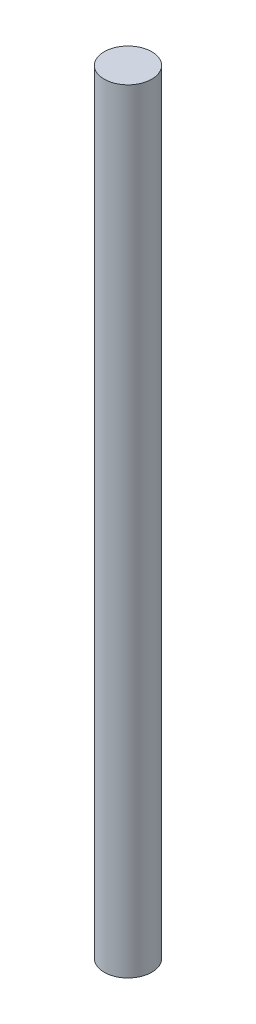
ISO-10303-21;
HEADER;
FILE_DESCRIPTION(('STEP AP214'),'2;1');
FILE_NAME('part.step','',(''),(''),'','','');
FILE_SCHEMA(('AUTOMOTIVE_DESIGN { 1 0 10303 214 1 1 1 1 }'));
ENDSEC;
DATA;
#1=APPLICATION_CONTEXT('core data for automotive mechanical design processes');
#2=APPLICATION_PROTOCOL_DEFINITION('international standard','automotive_design',2000,#1);
#3=PRODUCT_CONTEXT('',#1,'mechanical');
#4=PRODUCT('Part','Part','',(#3));
#5=PRODUCT_RELATED_PRODUCT_CATEGORY('part','',(#4));
#6=PRODUCT_DEFINITION_FORMATION('','',#4);
#7=PRODUCT_DEFINITION_CONTEXT('part definition',#1,'design');
#8=PRODUCT_DEFINITION('design','',#6,#7);
#9=PRODUCT_DEFINITION_SHAPE('','',#8);
#10=(LENGTH_UNIT() NAMED_UNIT(*) SI_UNIT(.MILLI.,.METRE.));
#11=(NAMED_UNIT(*) PLANE_ANGLE_UNIT() SI_UNIT($,.RADIAN.));
#12=(NAMED_UNIT(*) SI_UNIT($,.STERADIAN.) SOLID_ANGLE_UNIT());
#13=UNCERTAINTY_MEASURE_WITH_UNIT(LENGTH_MEASURE(1.E-05),#10,'distance_accuracy_value','');
#14=(GEOMETRIC_REPRESENTATION_CONTEXT(3) GLOBAL_UNCERTAINTY_ASSIGNED_CONTEXT((#13)) GLOBAL_UNIT_ASSIGNED_CONTEXT((#10,
#11,#12)) REPRESENTATION_CONTEXT('',''));
#15=CARTESIAN_POINT('',(0.,0.,0.));
#16=DIRECTION('',(0.,0.,1.));
#17=DIRECTION('',(1.,0.,0.));
#18=AXIS2_PLACEMENT_3D('',#15,#16,#17);
#19=CARTESIAN_POINT('',(0.,325.,0.));
#20=DIRECTION('',(0.,-1.,0.));
#21=DIRECTION('',(0.,0.,-1.));
#22=AXIS2_PLACEMENT_3D('',#19,#20,#21);
#23=CYLINDRICAL_SURFACE('',#22,10.);
#24=CARTESIAN_POINT('',(0.,325.,0.));
#25=DIRECTION('',(0.,1.,0.));
#26=DIRECTION('',(0.,0.,1.));
#27=AXIS2_PLACEMENT_3D('',#24,#25,#26);
#28=CIRCLE('',#27,10.);
#29=CARTESIAN_POINT('',(0.,325.,10.));
#30=VERTEX_POINT('',#29);
#31=EDGE_CURVE('E10',#30,#30,#28,.T.);
#32=ORIENTED_EDGE('',*,*,#31,.F.);
#33=EDGE_LOOP('',(#32));
#34=FACE_BOUND('',#33,.T.);
#35=CARTESIAN_POINT('',(0.,0.,0.));
#36=DIRECTION('',(0.,1.,0.));
#37=DIRECTION('',(0.,0.,1.));
#38=AXIS2_PLACEMENT_3D('',#35,#36,#37);
#39=CIRCLE('',#38,10.);
#40=CARTESIAN_POINT('',(0.,0.,10.));
#41=VERTEX_POINT('',#40);
#42=EDGE_CURVE('E31',#41,#41,#39,.T.);
#43=ORIENTED_EDGE('',*,*,#42,.T.);
#44=EDGE_LOOP('',(#43));
#45=FACE_BOUND('',#44,.T.);
#46=ADVANCED_FACE('F28',(#34,#45),#23,.T.);
#47=CARTESIAN_POINT('',(0.,325.,0.));
#48=DIRECTION('',(0.,1.,0.));
#49=DIRECTION('',(0.,0.,1.));
#50=AXIS2_PLACEMENT_3D('',#47,#48,#49);
#51=PLANE('',#50);
#52=ORIENTED_EDGE('',*,*,#31,.T.);
#53=EDGE_LOOP('',(#52));
#54=FACE_BOUND('',#53,.T.);
#55=ADVANCED_FACE('F43',(#54),#51,.T.);
#56=CARTESIAN_POINT('',(0.,0.,0.));
#57=DIRECTION('',(0.,1.,0.));
#58=DIRECTION('',(0.,0.,1.));
#59=AXIS2_PLACEMENT_3D('',#56,#57,#58);
#60=PLANE('',#59);
#61=ORIENTED_EDGE('',*,*,#42,.F.);
#62=EDGE_LOOP('',(#61));
#63=FACE_BOUND('',#62,.T.);
#64=ADVANCED_FACE('F41',(#63),#60,.F.);
#65=CLOSED_SHELL('',(#46,#55,#64));
#66=MANIFOLD_SOLID_BREP('B2',#65);
#67=ADVANCED_BREP_SHAPE_REPRESENTATION('',(#18,#66),#14);
#68=SHAPE_DEFINITION_REPRESENTATION(#9,#67);
ENDSEC;
END-ISO-10303-21;
